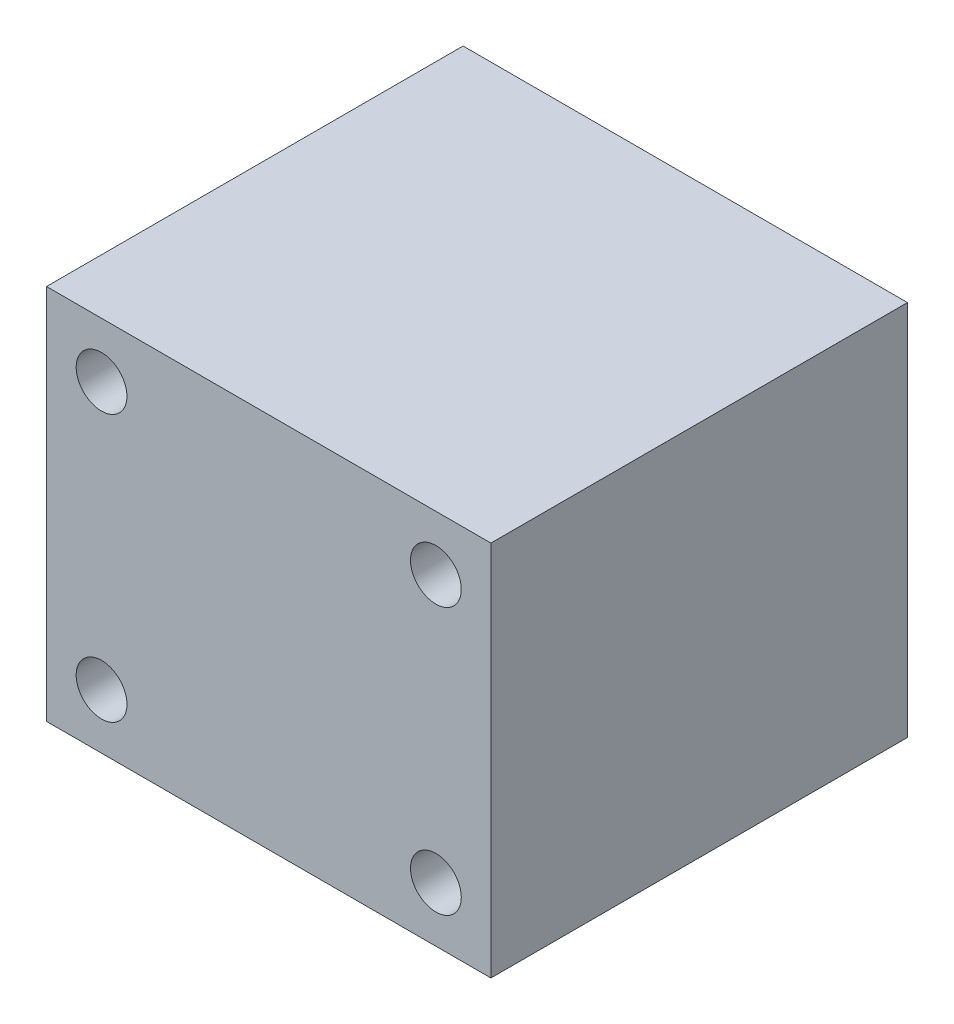
ISO-10303-21;
HEADER;
FILE_DESCRIPTION(('STEP AP214'),'2;1');
FILE_NAME('part.step','',(''),(''),'','','');
FILE_SCHEMA(('AUTOMOTIVE_DESIGN { 1 0 10303 214 1 1 1 1 }'));
ENDSEC;
DATA;
#1=APPLICATION_CONTEXT('core data for automotive mechanical design processes');
#2=APPLICATION_PROTOCOL_DEFINITION('international standard','automotive_design',2000,#1);
#3=PRODUCT_CONTEXT('',#1,'mechanical');
#4=PRODUCT('Part','Part','',(#3));
#5=PRODUCT_RELATED_PRODUCT_CATEGORY('part','',(#4));
#6=PRODUCT_DEFINITION_FORMATION('','',#4);
#7=PRODUCT_DEFINITION_CONTEXT('part definition',#1,'design');
#8=PRODUCT_DEFINITION('design','',#6,#7);
#9=PRODUCT_DEFINITION_SHAPE('','',#8);
#10=(LENGTH_UNIT() NAMED_UNIT(*) SI_UNIT(.MILLI.,.METRE.));
#11=(NAMED_UNIT(*) PLANE_ANGLE_UNIT() SI_UNIT($,.RADIAN.));
#12=(NAMED_UNIT(*) SI_UNIT($,.STERADIAN.) SOLID_ANGLE_UNIT());
#13=UNCERTAINTY_MEASURE_WITH_UNIT(LENGTH_MEASURE(1.E-05),#10,'distance_accuracy_value','');
#14=(GEOMETRIC_REPRESENTATION_CONTEXT(3) GLOBAL_UNCERTAINTY_ASSIGNED_CONTEXT((#13)) GLOBAL_UNIT_ASSIGNED_CONTEXT((#10,
#11,#12)) REPRESENTATION_CONTEXT('',''));
#15=CARTESIAN_POINT('',(0.,0.,0.));
#16=DIRECTION('',(0.,0.,1.));
#17=DIRECTION('',(1.,0.,0.));
#18=AXIS2_PLACEMENT_3D('',#15,#16,#17);
#19=CARTESIAN_POINT('',(0.,0.,25.));
#20=DIRECTION('',(0.,0.,1.));
#21=DIRECTION('',(1.,0.,0.));
#22=AXIS2_PLACEMENT_3D('',#19,#20,#21);
#23=PLANE('',#22);
#24=CARTESIAN_POINT('',(-10.033,8.001,25.));
#25=DIRECTION('',(0.,0.,1.));
#26=DIRECTION('',(-1.,0.,0.));
#27=AXIS2_PLACEMENT_3D('',#24,#25,#26);
#28=CIRCLE('',#27,1.524);
#29=CARTESIAN_POINT('',(-11.557,8.001,25.));
#30=VERTEX_POINT('',#29);
#31=EDGE_CURVE('E127',#30,#30,#28,.T.);
#32=ORIENTED_EDGE('',*,*,#31,.F.);
#33=EDGE_LOOP('',(#32));
#34=FACE_BOUND('',#33,.T.);
#35=CARTESIAN_POINT('',(10.033,-8.001,25.));
#36=DIRECTION('',(0.,0.,1.));
#37=DIRECTION('',(1.,0.,0.));
#38=AXIS2_PLACEMENT_3D('',#35,#36,#37);
#39=CIRCLE('',#38,1.524);
#40=CARTESIAN_POINT('',(11.557,-8.001,25.));
#41=VERTEX_POINT('',#40);
#42=EDGE_CURVE('E106',#41,#41,#39,.T.);
#43=ORIENTED_EDGE('',*,*,#42,.F.);
#44=EDGE_LOOP('',(#43));
#45=FACE_BOUND('',#44,.T.);
#46=DIRECTION('',(0.,-1.,0.));
#47=VECTOR('',#46,1.);
#48=CARTESIAN_POINT('',(-13.335,-11.303,25.));
#49=LINE('',#48,#47);
#50=CARTESIAN_POINT('',(-13.335,11.303,25.));
#51=VERTEX_POINT('',#50);
#52=CARTESIAN_POINT('',(-13.335,-11.303,25.));
#53=VERTEX_POINT('',#52);
#54=EDGE_CURVE('E91',#51,#53,#49,.T.);
#55=ORIENTED_EDGE('',*,*,#54,.T.);
#56=DIRECTION('',(1.,0.,0.));
#57=VECTOR('',#56,1.);
#58=CARTESIAN_POINT('',(13.335,-11.303,25.));
#59=LINE('',#58,#57);
#60=CARTESIAN_POINT('',(13.335,-11.303,25.));
#61=VERTEX_POINT('',#60);
#62=EDGE_CURVE('E86',#53,#61,#59,.T.);
#63=ORIENTED_EDGE('',*,*,#62,.T.);
#64=DIRECTION('',(0.,1.,0.));
#65=VECTOR('',#64,1.);
#66=CARTESIAN_POINT('',(13.335,-11.303,25.));
#67=LINE('',#66,#65);
#68=CARTESIAN_POINT('',(13.335,11.303,25.));
#69=VERTEX_POINT('',#68);
#70=EDGE_CURVE('E89',#61,#69,#67,.T.);
#71=ORIENTED_EDGE('',*,*,#70,.T.);
#72=DIRECTION('',(-1.,0.,0.));
#73=VECTOR('',#72,1.);
#74=CARTESIAN_POINT('',(13.335,11.303,25.));
#75=LINE('',#74,#73);
#76=EDGE_CURVE('E56',#69,#51,#75,.T.);
#77=ORIENTED_EDGE('',*,*,#76,.T.);
#78=EDGE_LOOP('',(#55,#63,#71,#77));
#79=FACE_BOUND('',#78,.T.);
#80=CARTESIAN_POINT('',(10.033,8.001,25.));
#81=DIRECTION('',(0.,0.,1.));
#82=DIRECTION('',(-1.,0.,0.));
#83=AXIS2_PLACEMENT_3D('',#80,#81,#82);
#84=CIRCLE('',#83,1.524);
#85=CARTESIAN_POINT('',(8.50899999999999,8.001,25.));
#86=VERTEX_POINT('',#85);
#87=EDGE_CURVE('E121',#86,#86,#84,.T.);
#88=ORIENTED_EDGE('',*,*,#87,.F.);
#89=EDGE_LOOP('',(#88));
#90=FACE_BOUND('',#89,.T.);
#91=CARTESIAN_POINT('',(-10.033,-8.001,25.));
#92=DIRECTION('',(0.,0.,1.));
#93=DIRECTION('',(1.,0.,0.));
#94=AXIS2_PLACEMENT_3D('',#91,#92,#93);
#95=CIRCLE('',#94,1.524);
#96=CARTESIAN_POINT('',(-8.509,-8.001,25.));
#97=VERTEX_POINT('',#96);
#98=EDGE_CURVE('E133',#97,#97,#95,.T.);
#99=ORIENTED_EDGE('',*,*,#98,.F.);
#100=EDGE_LOOP('',(#99));
#101=FACE_BOUND('',#100,.T.);
#102=ADVANCED_FACE('F39',(#34,#45,#79,#90,#101),#23,.T.);
#103=CARTESIAN_POINT('',(0.,0.,0.));
#104=DIRECTION('',(0.,0.,1.));
#105=DIRECTION('',(1.,0.,0.));
#106=AXIS2_PLACEMENT_3D('',#103,#104,#105);
#107=PLANE('',#106);
#108=DIRECTION('',(0.,-1.,0.));
#109=VECTOR('',#108,1.);
#110=CARTESIAN_POINT('',(-13.335,-11.303,0.));
#111=LINE('',#110,#109);
#112=CARTESIAN_POINT('',(-13.335,11.303,0.));
#113=VERTEX_POINT('',#112);
#114=CARTESIAN_POINT('',(-13.335,-11.303,0.));
#115=VERTEX_POINT('',#114);
#116=EDGE_CURVE('E103',#113,#115,#111,.T.);
#117=ORIENTED_EDGE('',*,*,#116,.F.);
#118=DIRECTION('',(-1.,0.,0.));
#119=VECTOR('',#118,1.);
#120=CARTESIAN_POINT('',(13.335,11.303,0.));
#121=LINE('',#120,#119);
#122=CARTESIAN_POINT('',(13.335,11.303,0.));
#123=VERTEX_POINT('',#122);
#124=EDGE_CURVE('E79',#123,#113,#121,.T.);
#125=ORIENTED_EDGE('',*,*,#124,.F.);
#126=DIRECTION('',(0.,1.,0.));
#127=VECTOR('',#126,1.);
#128=CARTESIAN_POINT('',(13.335,-11.303,0.));
#129=LINE('',#128,#127);
#130=CARTESIAN_POINT('',(13.335,-11.303,0.));
#131=VERTEX_POINT('',#130);
#132=EDGE_CURVE('E73',#131,#123,#129,.T.);
#133=ORIENTED_EDGE('',*,*,#132,.F.);
#134=DIRECTION('',(1.,0.,0.));
#135=VECTOR('',#134,1.);
#136=CARTESIAN_POINT('',(13.335,-11.303,0.));
#137=LINE('',#136,#135);
#138=EDGE_CURVE('E95',#115,#131,#137,.T.);
#139=ORIENTED_EDGE('',*,*,#138,.F.);
#140=EDGE_LOOP('',(#117,#125,#133,#139));
#141=FACE_BOUND('',#140,.T.);
#142=CARTESIAN_POINT('',(10.033,-8.001,0.));
#143=DIRECTION('',(0.,0.,1.));
#144=DIRECTION('',(1.,0.,0.));
#145=AXIS2_PLACEMENT_3D('',#142,#143,#144);
#146=CIRCLE('',#145,1.524);
#147=CARTESIAN_POINT('',(11.557,-8.001,0.));
#148=VERTEX_POINT('',#147);
#149=EDGE_CURVE('E118',#148,#148,#146,.T.);
#150=ORIENTED_EDGE('',*,*,#149,.T.);
#151=EDGE_LOOP('',(#150));
#152=FACE_BOUND('',#151,.T.);
#153=CARTESIAN_POINT('',(10.033,8.001,0.));
#154=DIRECTION('',(0.,0.,1.));
#155=DIRECTION('',(-1.,0.,0.));
#156=AXIS2_PLACEMENT_3D('',#153,#154,#155);
#157=CIRCLE('',#156,1.524);
#158=CARTESIAN_POINT('',(8.50899999999999,8.001,0.));
#159=VERTEX_POINT('',#158);
#160=EDGE_CURVE('E124',#159,#159,#157,.T.);
#161=ORIENTED_EDGE('',*,*,#160,.T.);
#162=EDGE_LOOP('',(#161));
#163=FACE_BOUND('',#162,.T.);
#164=CARTESIAN_POINT('',(-10.033,8.001,0.));
#165=DIRECTION('',(0.,0.,1.));
#166=DIRECTION('',(-1.,0.,0.));
#167=AXIS2_PLACEMENT_3D('',#164,#165,#166);
#168=CIRCLE('',#167,1.524);
#169=CARTESIAN_POINT('',(-11.557,8.001,0.));
#170=VERTEX_POINT('',#169);
#171=EDGE_CURVE('E130',#170,#170,#168,.T.);
#172=ORIENTED_EDGE('',*,*,#171,.T.);
#173=EDGE_LOOP('',(#172));
#174=FACE_BOUND('',#173,.T.);
#175=CARTESIAN_POINT('',(-10.033,-8.001,0.));
#176=DIRECTION('',(0.,0.,1.));
#177=DIRECTION('',(1.,0.,0.));
#178=AXIS2_PLACEMENT_3D('',#175,#176,#177);
#179=CIRCLE('',#178,1.524);
#180=CARTESIAN_POINT('',(-8.509,-8.001,0.));
#181=VERTEX_POINT('',#180);
#182=EDGE_CURVE('E136',#181,#181,#179,.T.);
#183=ORIENTED_EDGE('',*,*,#182,.T.);
#184=EDGE_LOOP('',(#183));
#185=FACE_BOUND('',#184,.T.);
#186=ADVANCED_FACE('F114',(#141,#152,#163,#174,#185),#107,.F.);
#187=CARTESIAN_POINT('',(-13.335,-11.303,25.));
#188=DIRECTION('',(1.,0.,0.));
#189=DIRECTION('',(0.,0.,-1.));
#190=AXIS2_PLACEMENT_3D('',#187,#188,#189);
#191=PLANE('',#190);
#192=ORIENTED_EDGE('',*,*,#116,.T.);
#193=DIRECTION('',(0.,0.,-1.));
#194=VECTOR('',#193,1.);
#195=CARTESIAN_POINT('',(-13.335,-11.303,25.));
#196=LINE('',#195,#194);
#197=EDGE_CURVE('E11',#53,#115,#196,.T.);
#198=ORIENTED_EDGE('',*,*,#197,.F.);
#199=ORIENTED_EDGE('',*,*,#54,.F.);
#200=DIRECTION('',(0.,0.,-1.));
#201=VECTOR('',#200,1.);
#202=CARTESIAN_POINT('',(-13.335,11.303,25.));
#203=LINE('',#202,#201);
#204=EDGE_CURVE('E99',#51,#113,#203,.T.);
#205=ORIENTED_EDGE('',*,*,#204,.T.);
#206=EDGE_LOOP('',(#192,#198,#199,#205));
#207=FACE_BOUND('',#206,.T.);
#208=ADVANCED_FACE('F41',(#207),#191,.F.);
#209=CARTESIAN_POINT('',(13.335,-11.303,25.));
#210=DIRECTION('',(0.,1.,0.));
#211=DIRECTION('',(-1.,0.,0.));
#212=AXIS2_PLACEMENT_3D('',#209,#210,#211);
#213=PLANE('',#212);
#214=ORIENTED_EDGE('',*,*,#138,.T.);
#215=DIRECTION('',(0.,0.,-1.));
#216=VECTOR('',#215,1.);
#217=CARTESIAN_POINT('',(13.335,-11.303,25.));
#218=LINE('',#217,#216);
#219=EDGE_CURVE('E48',#61,#131,#218,.T.);
#220=ORIENTED_EDGE('',*,*,#219,.F.);
#221=ORIENTED_EDGE('',*,*,#62,.F.);
#222=ORIENTED_EDGE('',*,*,#197,.T.);
#223=EDGE_LOOP('',(#214,#220,#221,#222));
#224=FACE_BOUND('',#223,.T.);
#225=ADVANCED_FACE('F94',(#224),#213,.F.);
#226=CARTESIAN_POINT('',(13.335,-11.303,25.));
#227=DIRECTION('',(-1.,0.,0.));
#228=DIRECTION('',(0.,-1.,0.));
#229=AXIS2_PLACEMENT_3D('',#226,#227,#228);
#230=PLANE('',#229);
#231=ORIENTED_EDGE('',*,*,#132,.T.);
#232=DIRECTION('',(0.,0.,-1.));
#233=VECTOR('',#232,1.);
#234=CARTESIAN_POINT('',(13.335,11.303,25.));
#235=LINE('',#234,#233);
#236=EDGE_CURVE('E96',#69,#123,#235,.T.);
#237=ORIENTED_EDGE('',*,*,#236,.F.);
#238=ORIENTED_EDGE('',*,*,#70,.F.);
#239=ORIENTED_EDGE('',*,*,#219,.T.);
#240=EDGE_LOOP('',(#231,#237,#238,#239));
#241=FACE_BOUND('',#240,.T.);
#242=ADVANCED_FACE('F97',(#241),#230,.F.);
#243=CARTESIAN_POINT('',(13.335,11.303,25.));
#244=DIRECTION('',(0.,-1.,0.));
#245=DIRECTION('',(1.,0.,0.));
#246=AXIS2_PLACEMENT_3D('',#243,#244,#245);
#247=PLANE('',#246);
#248=ORIENTED_EDGE('',*,*,#124,.T.);
#249=ORIENTED_EDGE('',*,*,#204,.F.);
#250=ORIENTED_EDGE('',*,*,#76,.F.);
#251=ORIENTED_EDGE('',*,*,#236,.T.);
#252=EDGE_LOOP('',(#248,#249,#250,#251));
#253=FACE_BOUND('',#252,.T.);
#254=ADVANCED_FACE('F111',(#253),#247,.F.);
#255=CARTESIAN_POINT('',(10.033,-8.001,25.));
#256=DIRECTION('',(0.,0.,-1.));
#257=DIRECTION('',(-1.,0.,0.));
#258=AXIS2_PLACEMENT_3D('',#255,#256,#257);
#259=CYLINDRICAL_SURFACE('',#258,1.524);
#260=ORIENTED_EDGE('',*,*,#42,.T.);
#261=EDGE_LOOP('',(#260));
#262=FACE_BOUND('',#261,.T.);
#263=ORIENTED_EDGE('',*,*,#149,.F.);
#264=EDGE_LOOP('',(#263));
#265=FACE_BOUND('',#264,.T.);
#266=ADVANCED_FACE('F155',(#262,#265),#259,.F.);
#267=CARTESIAN_POINT('',(10.033,8.001,25.));
#268=DIRECTION('',(0.,0.,-1.));
#269=DIRECTION('',(-1.,0.,0.));
#270=AXIS2_PLACEMENT_3D('',#267,#268,#269);
#271=CYLINDRICAL_SURFACE('',#270,1.524);
#272=ORIENTED_EDGE('',*,*,#87,.T.);
#273=EDGE_LOOP('',(#272));
#274=FACE_BOUND('',#273,.T.);
#275=ORIENTED_EDGE('',*,*,#160,.F.);
#276=EDGE_LOOP('',(#275));
#277=FACE_BOUND('',#276,.T.);
#278=ADVANCED_FACE('F200',(#274,#277),#271,.F.);
#279=CARTESIAN_POINT('',(-10.033,8.001,25.));
#280=DIRECTION('',(0.,0.,-1.));
#281=DIRECTION('',(-1.,0.,0.));
#282=AXIS2_PLACEMENT_3D('',#279,#280,#281);
#283=CYLINDRICAL_SURFACE('',#282,1.524);
#284=ORIENTED_EDGE('',*,*,#31,.T.);
#285=EDGE_LOOP('',(#284));
#286=FACE_BOUND('',#285,.T.);
#287=ORIENTED_EDGE('',*,*,#171,.F.);
#288=EDGE_LOOP('',(#287));
#289=FACE_BOUND('',#288,.T.);
#290=ADVANCED_FACE('F208',(#286,#289),#283,.F.);
#291=CARTESIAN_POINT('',(-10.033,-8.001,25.));
#292=DIRECTION('',(0.,0.,-1.));
#293=DIRECTION('',(-1.,0.,0.));
#294=AXIS2_PLACEMENT_3D('',#291,#292,#293);
#295=CYLINDRICAL_SURFACE('',#294,1.524);
#296=ORIENTED_EDGE('',*,*,#98,.T.);
#297=EDGE_LOOP('',(#296));
#298=FACE_BOUND('',#297,.T.);
#299=ORIENTED_EDGE('',*,*,#182,.F.);
#300=EDGE_LOOP('',(#299));
#301=FACE_BOUND('',#300,.T.);
#302=ADVANCED_FACE('F142',(#298,#301),#295,.F.);
#303=CLOSED_SHELL('',(#102,#186,#208,#225,#242,#254,#266,#278,#290,#302));
#304=MANIFOLD_SOLID_BREP('B2',#303);
#305=ADVANCED_BREP_SHAPE_REPRESENTATION('',(#18,#304),#14);
#306=SHAPE_DEFINITION_REPRESENTATION(#9,#305);
ENDSEC;
END-ISO-10303-21;
